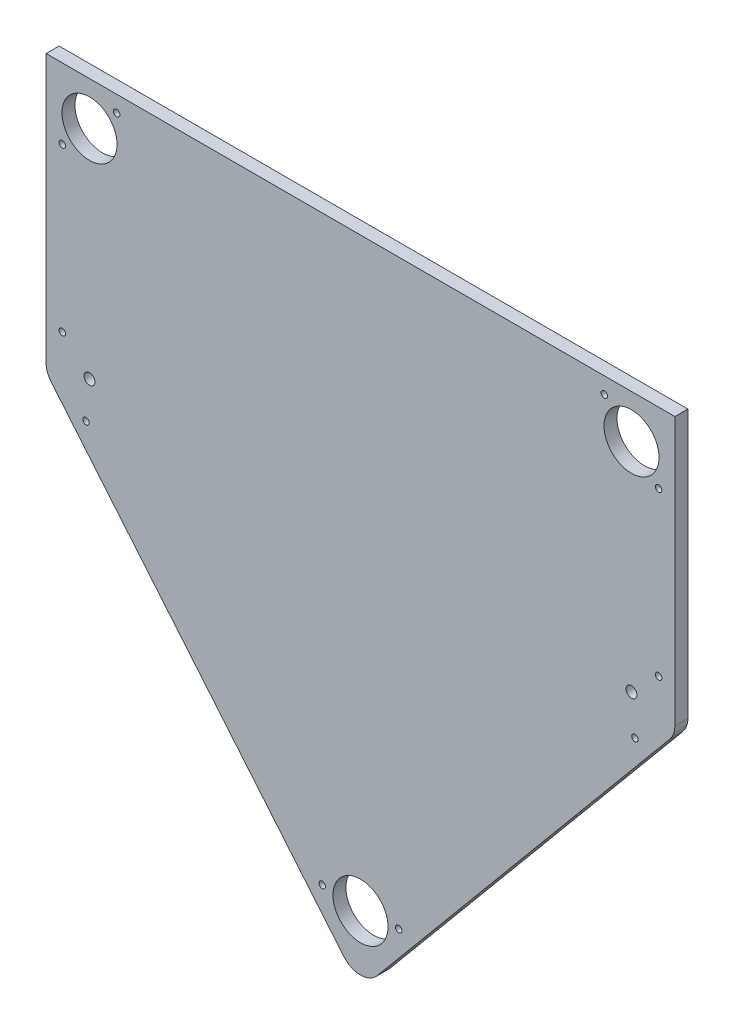
ISO-10303-21;
HEADER;
FILE_DESCRIPTION(('STEP AP214'),'2;1');
FILE_NAME('part.step','',(''),(''),'','','');
FILE_SCHEMA(('AUTOMOTIVE_DESIGN { 1 0 10303 214 1 1 1 1 }'));
ENDSEC;
DATA;
#1=APPLICATION_CONTEXT('core data for automotive mechanical design processes');
#2=APPLICATION_PROTOCOL_DEFINITION('international standard','automotive_design',2000,#1);
#3=PRODUCT_CONTEXT('',#1,'mechanical');
#4=PRODUCT('Part','Part','',(#3));
#5=PRODUCT_RELATED_PRODUCT_CATEGORY('part','',(#4));
#6=PRODUCT_DEFINITION_FORMATION('','',#4);
#7=PRODUCT_DEFINITION_CONTEXT('part definition',#1,'design');
#8=PRODUCT_DEFINITION('design','',#6,#7);
#9=PRODUCT_DEFINITION_SHAPE('','',#8);
#10=(LENGTH_UNIT() NAMED_UNIT(*) SI_UNIT(.MILLI.,.METRE.));
#11=(NAMED_UNIT(*) PLANE_ANGLE_UNIT() SI_UNIT($,.RADIAN.));
#12=(NAMED_UNIT(*) SI_UNIT($,.STERADIAN.) SOLID_ANGLE_UNIT());
#13=UNCERTAINTY_MEASURE_WITH_UNIT(LENGTH_MEASURE(1.E-05),#10,'distance_accuracy_value','');
#14=(GEOMETRIC_REPRESENTATION_CONTEXT(3) GLOBAL_UNCERTAINTY_ASSIGNED_CONTEXT((#13)) GLOBAL_UNIT_ASSIGNED_CONTEXT((#10,
#11,#12)) REPRESENTATION_CONTEXT('',''));
#15=CARTESIAN_POINT('',(0.,0.,0.));
#16=DIRECTION('',(0.,0.,1.));
#17=DIRECTION('',(1.,0.,0.));
#18=AXIS2_PLACEMENT_3D('',#15,#16,#17);
#19=CARTESIAN_POINT('',(0.,0.,6.));
#20=DIRECTION('',(0.,0.,-1.));
#21=DIRECTION('',(-1.,0.,0.));
#22=AXIS2_PLACEMENT_3D('',#19,#20,#21);
#23=PLANE('',#22);
#24=DIRECTION('',(0.,-1.,0.));
#25=VECTOR('',#24,1.);
#26=CARTESIAN_POINT('',(-145.,-7.24099870362663,6.));
#27=LINE('',#26,#25);
#28=CARTESIAN_POINT('',(-145.,120.,6.));
#29=VERTEX_POINT('',#28);
#30=CARTESIAN_POINT('',(-145.,-3.62049935181336,6.));
#31=VERTEX_POINT('',#30);
#32=EDGE_CURVE('E141',#29,#31,#27,.T.);
#33=ORIENTED_EDGE('',*,*,#32,.T.);
#34=CARTESIAN_POINT('',(-135.,-3.62049935181336,6.));
#35=DIRECTION('',(0.,0.,-1.));
#36=DIRECTION('',(-1.,0.,0.));
#37=AXIS2_PLACEMENT_3D('',#34,#35,#36);
#38=CIRCLE('',#37,10.);
#39=CARTESIAN_POINT('',(-142.682212795974,-10.0223433484581,6.));
#40=VERTEX_POINT('',#39);
#41=EDGE_CURVE('E158',#31,#40,#38,.F.);
#42=ORIENTED_EDGE('',*,*,#41,.T.);
#43=DIRECTION('',(0.64018439966448,-0.768221279597376,0.));
#44=VECTOR('',#43,1.);
#45=CARTESIAN_POINT('',(0.,-181.240998703627,6.));
#46=LINE('',#45,#44);
#47=CARTESIAN_POINT('',(-7.68221279597373,-172.022343348458,6.));
#48=VERTEX_POINT('',#47);
#49=EDGE_CURVE('E215',#40,#48,#46,.T.);
#50=ORIENTED_EDGE('',*,*,#49,.T.);
#51=CARTESIAN_POINT('',(0.,-165.620499351813,6.));
#52=DIRECTION('',(0.,0.,-1.));
#53=DIRECTION('',(-1.,0.,0.));
#54=AXIS2_PLACEMENT_3D('',#51,#52,#53);
#55=CIRCLE('',#54,10.);
#56=CARTESIAN_POINT('',(7.68221279597378,-172.022343348458,6.));
#57=VERTEX_POINT('',#56);
#58=EDGE_CURVE('E155',#48,#57,#55,.F.);
#59=ORIENTED_EDGE('',*,*,#58,.T.);
#60=DIRECTION('',(0.64018439966448,0.768221279597375,0.));
#61=VECTOR('',#60,1.);
#62=CARTESIAN_POINT('',(145.,-7.24099870362678,6.));
#63=LINE('',#62,#61);
#64=CARTESIAN_POINT('',(142.682212795974,-10.0223433484583,6.));
#65=VERTEX_POINT('',#64);
#66=EDGE_CURVE('E111',#57,#65,#63,.T.);
#67=ORIENTED_EDGE('',*,*,#66,.T.);
#68=CARTESIAN_POINT('',(135.,-3.62049935181347,6.));
#69=DIRECTION('',(0.,0.,-1.));
#70=DIRECTION('',(-1.,0.,0.));
#71=AXIS2_PLACEMENT_3D('',#68,#69,#70);
#72=CIRCLE('',#71,10.);
#73=CARTESIAN_POINT('',(145.,-3.62049935181347,6.));
#74=VERTEX_POINT('',#73);
#75=EDGE_CURVE('E54',#65,#74,#72,.F.);
#76=ORIENTED_EDGE('',*,*,#75,.T.);
#77=DIRECTION('',(0.,1.,0.));
#78=VECTOR('',#77,1.);
#79=CARTESIAN_POINT('',(145.,120.,6.));
#80=LINE('',#79,#78);
#81=CARTESIAN_POINT('',(145.,120.,6.));
#82=VERTEX_POINT('',#81);
#83=EDGE_CURVE('E101',#74,#82,#80,.T.);
#84=ORIENTED_EDGE('',*,*,#83,.T.);
#85=DIRECTION('',(-1.,0.,0.));
#86=VECTOR('',#85,1.);
#87=CARTESIAN_POINT('',(-145.,120.,6.));
#88=LINE('',#87,#86);
#89=EDGE_CURVE('E106',#82,#29,#88,.T.);
#90=ORIENTED_EDGE('',*,*,#89,.T.);
#91=EDGE_LOOP('',(#33,#42,#50,#59,#67,#76,#84,#90));
#92=FACE_BOUND('',#91,.T.);
#93=CARTESIAN_POINT('',(-125.,100.,6.));
#94=DIRECTION('',(0.,0.,1.));
#95=DIRECTION('',(1.,0.,0.));
#96=AXIS2_PLACEMENT_3D('',#93,#94,#95);
#97=CIRCLE('',#96,12.7);
#98=CARTESIAN_POINT('',(-112.3,100.,6.));
#99=VERTEX_POINT('',#98);
#100=EDGE_CURVE('E134',#99,#99,#97,.T.);
#101=ORIENTED_EDGE('',*,*,#100,.F.);
#102=EDGE_LOOP('',(#101));
#103=FACE_BOUND('',#102,.T.);
#104=CARTESIAN_POINT('',(125.,100.,6.));
#105=DIRECTION('',(0.,0.,1.));
#106=DIRECTION('',(1.,0.,0.));
#107=AXIS2_PLACEMENT_3D('',#104,#105,#106);
#108=CIRCLE('',#107,12.7);
#109=CARTESIAN_POINT('',(137.7,100.,6.));
#110=VERTEX_POINT('',#109);
#111=EDGE_CURVE('E223',#110,#110,#108,.T.);
#112=ORIENTED_EDGE('',*,*,#111,.F.);
#113=EDGE_LOOP('',(#112));
#114=FACE_BOUND('',#113,.T.);
#115=CARTESIAN_POINT('',(-125.,0.,6.));
#116=DIRECTION('',(0.,0.,1.));
#117=DIRECTION('',(1.,0.,0.));
#118=AXIS2_PLACEMENT_3D('',#115,#116,#117);
#119=CIRCLE('',#118,2.50000000000001);
#120=CARTESIAN_POINT('',(-122.5,0.,6.));
#121=VERTEX_POINT('',#120);
#122=EDGE_CURVE('E229',#121,#121,#119,.T.);
#123=ORIENTED_EDGE('',*,*,#122,.F.);
#124=EDGE_LOOP('',(#123));
#125=FACE_BOUND('',#124,.T.);
#126=CARTESIAN_POINT('',(125.,0.,6.));
#127=DIRECTION('',(0.,0.,1.));
#128=DIRECTION('',(1.,0.,0.));
#129=AXIS2_PLACEMENT_3D('',#126,#127,#128);
#130=CIRCLE('',#129,2.5);
#131=CARTESIAN_POINT('',(127.5,0.,6.));
#132=VERTEX_POINT('',#131);
#133=EDGE_CURVE('E235',#132,#132,#130,.T.);
#134=ORIENTED_EDGE('',*,*,#133,.F.);
#135=EDGE_LOOP('',(#134));
#136=FACE_BOUND('',#135,.T.);
#137=CARTESIAN_POINT('',(0.,-150.,6.));
#138=DIRECTION('',(0.,0.,1.));
#139=DIRECTION('',(1.,0.,0.));
#140=AXIS2_PLACEMENT_3D('',#137,#138,#139);
#141=CIRCLE('',#140,12.7);
#142=CARTESIAN_POINT('',(12.7,-150.,6.));
#143=VERTEX_POINT('',#142);
#144=EDGE_CURVE('E241',#143,#143,#141,.T.);
#145=ORIENTED_EDGE('',*,*,#144,.F.);
#146=EDGE_LOOP('',(#145));
#147=FACE_BOUND('',#146,.T.);
#148=CARTESIAN_POINT('',(-112.484209972998,112.515790027002,6.));
#149=DIRECTION('',(0.,0.,1.));
#150=DIRECTION('',(1.,0.,0.));
#151=AXIS2_PLACEMENT_3D('',#148,#149,#150);
#152=CIRCLE('',#151,1.5);
#153=CARTESIAN_POINT('',(-110.984209972998,112.515790027002,6.));
#154=VERTEX_POINT('',#153);
#155=EDGE_CURVE('E247',#154,#154,#152,.T.);
#156=ORIENTED_EDGE('',*,*,#155,.F.);
#157=EDGE_LOOP('',(#156));
#158=FACE_BOUND('',#157,.T.);
#159=CARTESIAN_POINT('',(-137.515790027002,87.4842099729981,6.));
#160=DIRECTION('',(0.,0.,1.));
#161=DIRECTION('',(1.,0.,0.));
#162=AXIS2_PLACEMENT_3D('',#159,#160,#161);
#163=CIRCLE('',#162,1.5);
#164=CARTESIAN_POINT('',(-136.015790027002,87.4842099729981,6.));
#165=VERTEX_POINT('',#164);
#166=EDGE_CURVE('E253',#165,#165,#163,.T.);
#167=ORIENTED_EDGE('',*,*,#166,.F.);
#168=EDGE_LOOP('',(#167));
#169=FACE_BOUND('',#168,.T.);
#170=CARTESIAN_POINT('',(-137.515790027002,12.5157900270019,6.));
#171=DIRECTION('',(0.,0.,1.));
#172=DIRECTION('',(1.,0.,0.));
#173=AXIS2_PLACEMENT_3D('',#170,#171,#172);
#174=CIRCLE('',#173,1.5);
#175=CARTESIAN_POINT('',(-136.015790027002,12.5157900270019,6.));
#176=VERTEX_POINT('',#175);
#177=EDGE_CURVE('E259',#176,#176,#174,.T.);
#178=ORIENTED_EDGE('',*,*,#177,.F.);
#179=EDGE_LOOP('',(#178));
#180=FACE_BOUND('',#179,.T.);
#181=CARTESIAN_POINT('',(-126.602482704953,-17.6273097544784,6.));
#182=DIRECTION('',(0.,0.,1.));
#183=DIRECTION('',(1.,0.,0.));
#184=AXIS2_PLACEMENT_3D('',#181,#182,#183);
#185=CIRCLE('',#184,1.5);
#186=CARTESIAN_POINT('',(-125.102482704953,-17.6273097544784,6.));
#187=VERTEX_POINT('',#186);
#188=EDGE_CURVE('E265',#187,#187,#185,.T.);
#189=ORIENTED_EDGE('',*,*,#188,.F.);
#190=EDGE_LOOP('',(#189));
#191=FACE_BOUND('',#190,.T.);
#192=CARTESIAN_POINT('',(-17.6273097544784,-148.397517295047,6.));
#193=DIRECTION('',(0.,0.,1.));
#194=DIRECTION('',(1.,0.,0.));
#195=AXIS2_PLACEMENT_3D('',#192,#193,#194);
#196=CIRCLE('',#195,1.5);
#197=CARTESIAN_POINT('',(-16.1273097544784,-148.397517295047,6.));
#198=VERTEX_POINT('',#197);
#199=EDGE_CURVE('E271',#198,#198,#196,.T.);
#200=ORIENTED_EDGE('',*,*,#199,.F.);
#201=EDGE_LOOP('',(#200));
#202=FACE_BOUND('',#201,.T.);
#203=CARTESIAN_POINT('',(17.6273097544784,-148.397517295047,6.));
#204=DIRECTION('',(0.,0.,1.));
#205=DIRECTION('',(-1.,0.,0.));
#206=AXIS2_PLACEMENT_3D('',#203,#204,#205);
#207=CIRCLE('',#206,1.5);
#208=CARTESIAN_POINT('',(16.1273097544784,-148.397517295047,6.));
#209=VERTEX_POINT('',#208);
#210=EDGE_CURVE('E277',#209,#209,#207,.T.);
#211=ORIENTED_EDGE('',*,*,#210,.F.);
#212=EDGE_LOOP('',(#211));
#213=FACE_BOUND('',#212,.T.);
#214=CARTESIAN_POINT('',(126.602482704953,-17.6273097544784,6.));
#215=DIRECTION('',(0.,0.,1.));
#216=DIRECTION('',(-1.,0.,0.));
#217=AXIS2_PLACEMENT_3D('',#214,#215,#216);
#218=CIRCLE('',#217,1.5);
#219=CARTESIAN_POINT('',(125.102482704953,-17.6273097544784,6.));
#220=VERTEX_POINT('',#219);
#221=EDGE_CURVE('E283',#220,#220,#218,.T.);
#222=ORIENTED_EDGE('',*,*,#221,.F.);
#223=EDGE_LOOP('',(#222));
#224=FACE_BOUND('',#223,.T.);
#225=CARTESIAN_POINT('',(137.515790027002,12.5157900270019,6.));
#226=DIRECTION('',(0.,0.,1.));
#227=DIRECTION('',(-1.,0.,0.));
#228=AXIS2_PLACEMENT_3D('',#225,#226,#227);
#229=CIRCLE('',#228,1.5);
#230=CARTESIAN_POINT('',(136.015790027002,12.5157900270019,6.));
#231=VERTEX_POINT('',#230);
#232=EDGE_CURVE('E289',#231,#231,#229,.T.);
#233=ORIENTED_EDGE('',*,*,#232,.F.);
#234=EDGE_LOOP('',(#233));
#235=FACE_BOUND('',#234,.T.);
#236=CARTESIAN_POINT('',(137.515790027002,87.4842099729981,6.));
#237=DIRECTION('',(0.,0.,1.));
#238=DIRECTION('',(-1.,0.,0.));
#239=AXIS2_PLACEMENT_3D('',#236,#237,#238);
#240=CIRCLE('',#239,1.5);
#241=CARTESIAN_POINT('',(136.015790027002,87.4842099729981,6.));
#242=VERTEX_POINT('',#241);
#243=EDGE_CURVE('E295',#242,#242,#240,.T.);
#244=ORIENTED_EDGE('',*,*,#243,.F.);
#245=EDGE_LOOP('',(#244));
#246=FACE_BOUND('',#245,.T.);
#247=CARTESIAN_POINT('',(112.484209972998,112.515790027002,6.));
#248=DIRECTION('',(0.,0.,1.));
#249=DIRECTION('',(-1.,0.,0.));
#250=AXIS2_PLACEMENT_3D('',#247,#248,#249);
#251=CIRCLE('',#250,1.5);
#252=CARTESIAN_POINT('',(110.984209972998,112.515790027002,6.));
#253=VERTEX_POINT('',#252);
#254=EDGE_CURVE('E301',#253,#253,#251,.T.);
#255=ORIENTED_EDGE('',*,*,#254,.F.);
#256=EDGE_LOOP('',(#255));
#257=FACE_BOUND('',#256,.T.);
#258=ADVANCED_FACE('F39',(#92,#103,#114,#125,#136,#147,#158,#169,#180,#191,#202,#213,#224,#235,
#246,#257),#23,.F.);
#259=CARTESIAN_POINT('',(0.,0.,0.));
#260=DIRECTION('',(0.,0.,-1.));
#261=DIRECTION('',(-1.,0.,0.));
#262=AXIS2_PLACEMENT_3D('',#259,#260,#261);
#263=PLANE('',#262);
#264=CARTESIAN_POINT('',(137.515790027002,87.4842099729981,0.));
#265=DIRECTION('',(0.,0.,1.));
#266=DIRECTION('',(-1.,0.,0.));
#267=AXIS2_PLACEMENT_3D('',#264,#265,#266);
#268=CIRCLE('',#267,1.5);
#269=CARTESIAN_POINT('',(136.015790027002,87.4842099729981,0.));
#270=VERTEX_POINT('',#269);
#271=EDGE_CURVE('E298',#270,#270,#268,.T.);
#272=ORIENTED_EDGE('',*,*,#271,.T.);
#273=EDGE_LOOP('',(#272));
#274=FACE_BOUND('',#273,.T.);
#275=CARTESIAN_POINT('',(126.602482704953,-17.6273097544784,0.));
#276=DIRECTION('',(0.,0.,1.));
#277=DIRECTION('',(-1.,0.,0.));
#278=AXIS2_PLACEMENT_3D('',#275,#276,#277);
#279=CIRCLE('',#278,1.5);
#280=CARTESIAN_POINT('',(125.102482704953,-17.6273097544784,0.));
#281=VERTEX_POINT('',#280);
#282=EDGE_CURVE('E286',#281,#281,#279,.T.);
#283=ORIENTED_EDGE('',*,*,#282,.T.);
#284=EDGE_LOOP('',(#283));
#285=FACE_BOUND('',#284,.T.);
#286=CARTESIAN_POINT('',(-17.6273097544784,-148.397517295047,0.));
#287=DIRECTION('',(0.,0.,1.));
#288=DIRECTION('',(1.,0.,0.));
#289=AXIS2_PLACEMENT_3D('',#286,#287,#288);
#290=CIRCLE('',#289,1.5);
#291=CARTESIAN_POINT('',(-16.1273097544784,-148.397517295047,0.));
#292=VERTEX_POINT('',#291);
#293=EDGE_CURVE('E274',#292,#292,#290,.T.);
#294=ORIENTED_EDGE('',*,*,#293,.T.);
#295=EDGE_LOOP('',(#294));
#296=FACE_BOUND('',#295,.T.);
#297=CARTESIAN_POINT('',(-137.515790027002,12.5157900270019,0.));
#298=DIRECTION('',(0.,0.,1.));
#299=DIRECTION('',(1.,0.,0.));
#300=AXIS2_PLACEMENT_3D('',#297,#298,#299);
#301=CIRCLE('',#300,1.5);
#302=CARTESIAN_POINT('',(-136.015790027002,12.5157900270019,0.));
#303=VERTEX_POINT('',#302);
#304=EDGE_CURVE('E262',#303,#303,#301,.T.);
#305=ORIENTED_EDGE('',*,*,#304,.T.);
#306=EDGE_LOOP('',(#305));
#307=FACE_BOUND('',#306,.T.);
#308=CARTESIAN_POINT('',(-112.484209972998,112.515790027002,0.));
#309=DIRECTION('',(0.,0.,1.));
#310=DIRECTION('',(1.,0.,0.));
#311=AXIS2_PLACEMENT_3D('',#308,#309,#310);
#312=CIRCLE('',#311,1.5);
#313=CARTESIAN_POINT('',(-110.984209972998,112.515790027002,0.));
#314=VERTEX_POINT('',#313);
#315=EDGE_CURVE('E250',#314,#314,#312,.T.);
#316=ORIENTED_EDGE('',*,*,#315,.T.);
#317=EDGE_LOOP('',(#316));
#318=FACE_BOUND('',#317,.T.);
#319=CARTESIAN_POINT('',(125.,0.,0.));
#320=DIRECTION('',(0.,0.,1.));
#321=DIRECTION('',(1.,0.,0.));
#322=AXIS2_PLACEMENT_3D('',#319,#320,#321);
#323=CIRCLE('',#322,2.5);
#324=CARTESIAN_POINT('',(127.5,0.,0.));
#325=VERTEX_POINT('',#324);
#326=EDGE_CURVE('E238',#325,#325,#323,.T.);
#327=ORIENTED_EDGE('',*,*,#326,.T.);
#328=EDGE_LOOP('',(#327));
#329=FACE_BOUND('',#328,.T.);
#330=CARTESIAN_POINT('',(125.,100.,0.));
#331=DIRECTION('',(0.,0.,1.));
#332=DIRECTION('',(1.,0.,0.));
#333=AXIS2_PLACEMENT_3D('',#330,#331,#332);
#334=CIRCLE('',#333,12.7);
#335=CARTESIAN_POINT('',(137.7,100.,0.));
#336=VERTEX_POINT('',#335);
#337=EDGE_CURVE('E226',#336,#336,#334,.T.);
#338=ORIENTED_EDGE('',*,*,#337,.T.);
#339=EDGE_LOOP('',(#338));
#340=FACE_BOUND('',#339,.T.);
#341=DIRECTION('',(0.64018439966448,-0.768221279597376,0.));
#342=VECTOR('',#341,1.);
#343=CARTESIAN_POINT('',(0.,-181.240998703627,0.));
#344=LINE('',#343,#342);
#345=CARTESIAN_POINT('',(-142.682212795974,-10.0223433484581,0.));
#346=VERTEX_POINT('',#345);
#347=CARTESIAN_POINT('',(-7.68221279597373,-172.022343348458,0.));
#348=VERTEX_POINT('',#347);
#349=EDGE_CURVE('E133',#346,#348,#344,.T.);
#350=ORIENTED_EDGE('',*,*,#349,.F.);
#351=CARTESIAN_POINT('',(-135.,-3.62049935181336,0.));
#352=DIRECTION('',(0.,0.,-1.));
#353=DIRECTION('',(-1.,0.,0.));
#354=AXIS2_PLACEMENT_3D('',#351,#352,#353);
#355=CIRCLE('',#354,10.);
#356=CARTESIAN_POINT('',(-145.,-3.62049935181336,0.));
#357=VERTEX_POINT('',#356);
#358=EDGE_CURVE('E151',#346,#357,#355,.T.);
#359=ORIENTED_EDGE('',*,*,#358,.T.);
#360=DIRECTION('',(0.,-1.,0.));
#361=VECTOR('',#360,1.);
#362=CARTESIAN_POINT('',(-145.,-7.24099870362663,0.));
#363=LINE('',#362,#361);
#364=CARTESIAN_POINT('',(-145.,120.,0.));
#365=VERTEX_POINT('',#364);
#366=EDGE_CURVE('E130',#365,#357,#363,.T.);
#367=ORIENTED_EDGE('',*,*,#366,.F.);
#368=DIRECTION('',(-1.,0.,0.));
#369=VECTOR('',#368,1.);
#370=CARTESIAN_POINT('',(-145.,120.,0.));
#371=LINE('',#370,#369);
#372=CARTESIAN_POINT('',(145.,120.,0.));
#373=VERTEX_POINT('',#372);
#374=EDGE_CURVE('E140',#373,#365,#371,.T.);
#375=ORIENTED_EDGE('',*,*,#374,.F.);
#376=DIRECTION('',(0.,1.,0.));
#377=VECTOR('',#376,1.);
#378=CARTESIAN_POINT('',(145.,120.,0.));
#379=LINE('',#378,#377);
#380=CARTESIAN_POINT('',(145.,-3.62049935181347,0.));
#381=VERTEX_POINT('',#380);
#382=EDGE_CURVE('E117',#381,#373,#379,.T.);
#383=ORIENTED_EDGE('',*,*,#382,.F.);
#384=CARTESIAN_POINT('',(135.,-3.62049935181347,0.));
#385=DIRECTION('',(0.,0.,-1.));
#386=DIRECTION('',(-1.,0.,0.));
#387=AXIS2_PLACEMENT_3D('',#384,#385,#386);
#388=CIRCLE('',#387,10.);
#389=CARTESIAN_POINT('',(142.682212795974,-10.0223433484583,0.));
#390=VERTEX_POINT('',#389);
#391=EDGE_CURVE('E149',#381,#390,#388,.T.);
#392=ORIENTED_EDGE('',*,*,#391,.T.);
#393=DIRECTION('',(0.64018439966448,0.768221279597375,0.));
#394=VECTOR('',#393,1.);
#395=CARTESIAN_POINT('',(145.,-7.24099870362678,0.));
#396=LINE('',#395,#394);
#397=CARTESIAN_POINT('',(7.68221279597378,-172.022343348458,0.));
#398=VERTEX_POINT('',#397);
#399=EDGE_CURVE('E137',#398,#390,#396,.T.);
#400=ORIENTED_EDGE('',*,*,#399,.F.);
#401=CARTESIAN_POINT('',(0.,-165.620499351813,0.));
#402=DIRECTION('',(0.,0.,-1.));
#403=DIRECTION('',(-1.,0.,0.));
#404=AXIS2_PLACEMENT_3D('',#401,#402,#403);
#405=CIRCLE('',#404,10.);
#406=EDGE_CURVE('E147',#398,#348,#405,.T.);
#407=ORIENTED_EDGE('',*,*,#406,.T.);
#408=EDGE_LOOP('',(#350,#359,#367,#375,#383,#392,#400,#407));
#409=FACE_BOUND('',#408,.T.);
#410=CARTESIAN_POINT('',(-125.,100.,0.));
#411=DIRECTION('',(0.,0.,1.));
#412=DIRECTION('',(1.,0.,0.));
#413=AXIS2_PLACEMENT_3D('',#410,#411,#412);
#414=CIRCLE('',#413,12.7);
#415=CARTESIAN_POINT('',(-112.3,100.,0.));
#416=VERTEX_POINT('',#415);
#417=EDGE_CURVE('E220',#416,#416,#414,.T.);
#418=ORIENTED_EDGE('',*,*,#417,.T.);
#419=EDGE_LOOP('',(#418));
#420=FACE_BOUND('',#419,.T.);
#421=CARTESIAN_POINT('',(-125.,0.,0.));
#422=DIRECTION('',(0.,0.,1.));
#423=DIRECTION('',(1.,0.,0.));
#424=AXIS2_PLACEMENT_3D('',#421,#422,#423);
#425=CIRCLE('',#424,2.50000000000001);
#426=CARTESIAN_POINT('',(-122.5,0.,0.));
#427=VERTEX_POINT('',#426);
#428=EDGE_CURVE('E232',#427,#427,#425,.T.);
#429=ORIENTED_EDGE('',*,*,#428,.T.);
#430=EDGE_LOOP('',(#429));
#431=FACE_BOUND('',#430,.T.);
#432=CARTESIAN_POINT('',(0.,-150.,0.));
#433=DIRECTION('',(0.,0.,1.));
#434=DIRECTION('',(1.,0.,0.));
#435=AXIS2_PLACEMENT_3D('',#432,#433,#434);
#436=CIRCLE('',#435,12.7);
#437=CARTESIAN_POINT('',(12.7,-150.,0.));
#438=VERTEX_POINT('',#437);
#439=EDGE_CURVE('E244',#438,#438,#436,.T.);
#440=ORIENTED_EDGE('',*,*,#439,.T.);
#441=EDGE_LOOP('',(#440));
#442=FACE_BOUND('',#441,.T.);
#443=CARTESIAN_POINT('',(-137.515790027002,87.4842099729981,0.));
#444=DIRECTION('',(0.,0.,1.));
#445=DIRECTION('',(1.,0.,0.));
#446=AXIS2_PLACEMENT_3D('',#443,#444,#445);
#447=CIRCLE('',#446,1.5);
#448=CARTESIAN_POINT('',(-136.015790027002,87.4842099729981,0.));
#449=VERTEX_POINT('',#448);
#450=EDGE_CURVE('E256',#449,#449,#447,.T.);
#451=ORIENTED_EDGE('',*,*,#450,.T.);
#452=EDGE_LOOP('',(#451));
#453=FACE_BOUND('',#452,.T.);
#454=CARTESIAN_POINT('',(-126.602482704953,-17.6273097544784,0.));
#455=DIRECTION('',(0.,0.,1.));
#456=DIRECTION('',(1.,0.,0.));
#457=AXIS2_PLACEMENT_3D('',#454,#455,#456);
#458=CIRCLE('',#457,1.5);
#459=CARTESIAN_POINT('',(-125.102482704953,-17.6273097544784,0.));
#460=VERTEX_POINT('',#459);
#461=EDGE_CURVE('E268',#460,#460,#458,.T.);
#462=ORIENTED_EDGE('',*,*,#461,.T.);
#463=EDGE_LOOP('',(#462));
#464=FACE_BOUND('',#463,.T.);
#465=CARTESIAN_POINT('',(17.6273097544784,-148.397517295047,0.));
#466=DIRECTION('',(0.,0.,1.));
#467=DIRECTION('',(-1.,0.,0.));
#468=AXIS2_PLACEMENT_3D('',#465,#466,#467);
#469=CIRCLE('',#468,1.5);
#470=CARTESIAN_POINT('',(16.1273097544784,-148.397517295047,0.));
#471=VERTEX_POINT('',#470);
#472=EDGE_CURVE('E280',#471,#471,#469,.T.);
#473=ORIENTED_EDGE('',*,*,#472,.T.);
#474=EDGE_LOOP('',(#473));
#475=FACE_BOUND('',#474,.T.);
#476=CARTESIAN_POINT('',(137.515790027002,12.5157900270019,0.));
#477=DIRECTION('',(0.,0.,1.));
#478=DIRECTION('',(-1.,0.,0.));
#479=AXIS2_PLACEMENT_3D('',#476,#477,#478);
#480=CIRCLE('',#479,1.5);
#481=CARTESIAN_POINT('',(136.015790027002,12.5157900270019,0.));
#482=VERTEX_POINT('',#481);
#483=EDGE_CURVE('E292',#482,#482,#480,.T.);
#484=ORIENTED_EDGE('',*,*,#483,.T.);
#485=EDGE_LOOP('',(#484));
#486=FACE_BOUND('',#485,.T.);
#487=CARTESIAN_POINT('',(112.484209972998,112.515790027002,0.));
#488=DIRECTION('',(0.,0.,1.));
#489=DIRECTION('',(-1.,0.,0.));
#490=AXIS2_PLACEMENT_3D('',#487,#488,#489);
#491=CIRCLE('',#490,1.5);
#492=CARTESIAN_POINT('',(110.984209972998,112.515790027002,0.));
#493=VERTEX_POINT('',#492);
#494=EDGE_CURVE('E304',#493,#493,#491,.T.);
#495=ORIENTED_EDGE('',*,*,#494,.T.);
#496=EDGE_LOOP('',(#495));
#497=FACE_BOUND('',#496,.T.);
#498=ADVANCED_FACE('F169',(#274,#285,#296,#307,#318,#329,#340,#409,#420,#431,#442,#453,#464,
#475,#486,#497),#263,.T.);
#499=CARTESIAN_POINT('',(-145.,-7.24099870362663,6.));
#500=DIRECTION('',(1.,0.,0.));
#501=DIRECTION('',(0.,0.,-1.));
#502=AXIS2_PLACEMENT_3D('',#499,#500,#501);
#503=PLANE('',#502);
#504=ORIENTED_EDGE('',*,*,#366,.T.);
#505=DIRECTION('',(0.,0.,-1.));
#506=VECTOR('',#505,1.);
#507=CARTESIAN_POINT('',(-145.,-3.62049935181336,6.));
#508=LINE('',#507,#506);
#509=EDGE_CURVE('E153',#357,#31,#508,.F.);
#510=ORIENTED_EDGE('',*,*,#509,.T.);
#511=ORIENTED_EDGE('',*,*,#32,.F.);
#512=DIRECTION('',(0.,0.,-1.));
#513=VECTOR('',#512,1.);
#514=CARTESIAN_POINT('',(-145.,120.,6.));
#515=LINE('',#514,#513);
#516=EDGE_CURVE('E121',#29,#365,#515,.T.);
#517=ORIENTED_EDGE('',*,*,#516,.T.);
#518=EDGE_LOOP('',(#504,#510,#511,#517));
#519=FACE_BOUND('',#518,.T.);
#520=ADVANCED_FACE('F188',(#519),#503,.F.);
#521=CARTESIAN_POINT('',(0.,-181.240998703627,6.));
#522=DIRECTION('',(0.768221279597376,0.64018439966448,0.));
#523=DIRECTION('',(-0.64018439966448,0.768221279597376,0.));
#524=AXIS2_PLACEMENT_3D('',#521,#522,#523);
#525=PLANE('',#524);
#526=ORIENTED_EDGE('',*,*,#49,.F.);
#527=DIRECTION('',(0.,0.,-1.));
#528=VECTOR('',#527,1.);
#529=CARTESIAN_POINT('',(-142.682212795974,-10.0223433484582,6.));
#530=LINE('',#529,#528);
#531=EDGE_CURVE('E144',#40,#346,#530,.T.);
#532=ORIENTED_EDGE('',*,*,#531,.T.);
#533=ORIENTED_EDGE('',*,*,#349,.T.);
#534=DIRECTION('',(0.,0.,-1.));
#535=VECTOR('',#534,1.);
#536=CARTESIAN_POINT('',(-7.68221279597373,-172.022343348458,6.));
#537=LINE('',#536,#535);
#538=EDGE_CURVE('E120',#348,#48,#537,.F.);
#539=ORIENTED_EDGE('',*,*,#538,.T.);
#540=EDGE_LOOP('',(#526,#532,#533,#539));
#541=FACE_BOUND('',#540,.T.);
#542=ADVANCED_FACE('F201',(#541),#525,.F.);
#543=CARTESIAN_POINT('',(145.,-7.24099870362678,6.));
#544=DIRECTION('',(-0.768221279597376,0.64018439966448,0.));
#545=DIRECTION('',(-0.64018439966448,-0.768221279597376,0.));
#546=AXIS2_PLACEMENT_3D('',#543,#544,#545);
#547=PLANE('',#546);
#548=ORIENTED_EDGE('',*,*,#399,.T.);
#549=DIRECTION('',(0.,0.,-1.));
#550=VECTOR('',#549,1.);
#551=CARTESIAN_POINT('',(142.682212795974,-10.0223433484583,6.));
#552=LINE('',#551,#550);
#553=EDGE_CURVE('E11',#390,#65,#552,.F.);
#554=ORIENTED_EDGE('',*,*,#553,.T.);
#555=ORIENTED_EDGE('',*,*,#66,.F.);
#556=DIRECTION('',(0.,0.,-1.));
#557=VECTOR('',#556,1.);
#558=CARTESIAN_POINT('',(7.68221279597378,-172.022343348458,6.));
#559=LINE('',#558,#557);
#560=EDGE_CURVE('E47',#57,#398,#559,.T.);
#561=ORIENTED_EDGE('',*,*,#560,.T.);
#562=EDGE_LOOP('',(#548,#554,#555,#561));
#563=FACE_BOUND('',#562,.T.);
#564=ADVANCED_FACE('F164',(#563),#547,.F.);
#565=CARTESIAN_POINT('',(145.,120.,6.));
#566=DIRECTION('',(-1.,0.,0.));
#567=DIRECTION('',(0.,-1.,0.));
#568=AXIS2_PLACEMENT_3D('',#565,#566,#567);
#569=PLANE('',#568);
#570=ORIENTED_EDGE('',*,*,#83,.F.);
#571=DIRECTION('',(0.,0.,-1.));
#572=VECTOR('',#571,1.);
#573=CARTESIAN_POINT('',(145.,-3.62049935181347,6.));
#574=LINE('',#573,#572);
#575=EDGE_CURVE('E160',#74,#381,#574,.T.);
#576=ORIENTED_EDGE('',*,*,#575,.T.);
#577=ORIENTED_EDGE('',*,*,#382,.T.);
#578=DIRECTION('',(0.,0.,-1.));
#579=VECTOR('',#578,1.);
#580=CARTESIAN_POINT('',(145.,120.,6.));
#581=LINE('',#580,#579);
#582=EDGE_CURVE('E114',#82,#373,#581,.T.);
#583=ORIENTED_EDGE('',*,*,#582,.F.);
#584=EDGE_LOOP('',(#570,#576,#577,#583));
#585=FACE_BOUND('',#584,.T.);
#586=ADVANCED_FACE('F115',(#585),#569,.F.);
#587=CARTESIAN_POINT('',(-145.,120.,6.));
#588=DIRECTION('',(0.,-1.,0.));
#589=DIRECTION('',(0.,0.,-1.));
#590=AXIS2_PLACEMENT_3D('',#587,#588,#589);
#591=PLANE('',#590);
#592=ORIENTED_EDGE('',*,*,#374,.T.);
#593=ORIENTED_EDGE('',*,*,#516,.F.);
#594=ORIENTED_EDGE('',*,*,#89,.F.);
#595=ORIENTED_EDGE('',*,*,#582,.T.);
#596=EDGE_LOOP('',(#592,#593,#594,#595));
#597=FACE_BOUND('',#596,.T.);
#598=ADVANCED_FACE('F123',(#597),#591,.F.);
#599=CARTESIAN_POINT('',(-125.,100.,6.));
#600=DIRECTION('',(0.,0.,-1.));
#601=DIRECTION('',(-1.,0.,0.));
#602=AXIS2_PLACEMENT_3D('',#599,#600,#601);
#603=CYLINDRICAL_SURFACE('',#602,12.7);
#604=ORIENTED_EDGE('',*,*,#100,.T.);
#605=EDGE_LOOP('',(#604));
#606=FACE_BOUND('',#605,.T.);
#607=ORIENTED_EDGE('',*,*,#417,.F.);
#608=EDGE_LOOP('',(#607));
#609=FACE_BOUND('',#608,.T.);
#610=ADVANCED_FACE('F192',(#606,#609),#603,.F.);
#611=CARTESIAN_POINT('',(125.,100.,6.));
#612=DIRECTION('',(0.,0.,-1.));
#613=DIRECTION('',(-1.,0.,0.));
#614=AXIS2_PLACEMENT_3D('',#611,#612,#613);
#615=CYLINDRICAL_SURFACE('',#614,12.7);
#616=ORIENTED_EDGE('',*,*,#111,.T.);
#617=EDGE_LOOP('',(#616));
#618=FACE_BOUND('',#617,.T.);
#619=ORIENTED_EDGE('',*,*,#337,.F.);
#620=EDGE_LOOP('',(#619));
#621=FACE_BOUND('',#620,.T.);
#622=ADVANCED_FACE('F364',(#618,#621),#615,.F.);
#623=CARTESIAN_POINT('',(-125.,0.,6.));
#624=DIRECTION('',(0.,0.,-1.));
#625=DIRECTION('',(-1.,0.,0.));
#626=AXIS2_PLACEMENT_3D('',#623,#624,#625);
#627=CYLINDRICAL_SURFACE('',#626,2.50000000000001);
#628=ORIENTED_EDGE('',*,*,#122,.T.);
#629=EDGE_LOOP('',(#628));
#630=FACE_BOUND('',#629,.T.);
#631=ORIENTED_EDGE('',*,*,#428,.F.);
#632=EDGE_LOOP('',(#631));
#633=FACE_BOUND('',#632,.T.);
#634=ADVANCED_FACE('F361',(#630,#633),#627,.F.);
#635=CARTESIAN_POINT('',(125.,0.,6.));
#636=DIRECTION('',(0.,0.,-1.));
#637=DIRECTION('',(-1.,0.,0.));
#638=AXIS2_PLACEMENT_3D('',#635,#636,#637);
#639=CYLINDRICAL_SURFACE('',#638,2.5);
#640=ORIENTED_EDGE('',*,*,#133,.T.);
#641=EDGE_LOOP('',(#640));
#642=FACE_BOUND('',#641,.T.);
#643=ORIENTED_EDGE('',*,*,#326,.F.);
#644=EDGE_LOOP('',(#643));
#645=FACE_BOUND('',#644,.T.);
#646=ADVANCED_FACE('F357',(#642,#645),#639,.F.);
#647=CARTESIAN_POINT('',(0.,-150.,6.));
#648=DIRECTION('',(0.,0.,-1.));
#649=DIRECTION('',(-1.,0.,0.));
#650=AXIS2_PLACEMENT_3D('',#647,#648,#649);
#651=CYLINDRICAL_SURFACE('',#650,12.7);
#652=ORIENTED_EDGE('',*,*,#144,.T.);
#653=EDGE_LOOP('',(#652));
#654=FACE_BOUND('',#653,.T.);
#655=ORIENTED_EDGE('',*,*,#439,.F.);
#656=EDGE_LOOP('',(#655));
#657=FACE_BOUND('',#656,.T.);
#658=ADVANCED_FACE('F353',(#654,#657),#651,.F.);
#659=CARTESIAN_POINT('',(-112.484209972998,112.515790027002,6.));
#660=DIRECTION('',(0.,0.,-1.));
#661=DIRECTION('',(-1.,0.,0.));
#662=AXIS2_PLACEMENT_3D('',#659,#660,#661);
#663=CYLINDRICAL_SURFACE('',#662,1.5);
#664=ORIENTED_EDGE('',*,*,#155,.T.);
#665=EDGE_LOOP('',(#664));
#666=FACE_BOUND('',#665,.T.);
#667=ORIENTED_EDGE('',*,*,#315,.F.);
#668=EDGE_LOOP('',(#667));
#669=FACE_BOUND('',#668,.T.);
#670=ADVANCED_FACE('F349',(#666,#669),#663,.F.);
#671=CARTESIAN_POINT('',(-137.515790027002,87.4842099729981,6.));
#672=DIRECTION('',(0.,0.,-1.));
#673=DIRECTION('',(-1.,0.,0.));
#674=AXIS2_PLACEMENT_3D('',#671,#672,#673);
#675=CYLINDRICAL_SURFACE('',#674,1.5);
#676=ORIENTED_EDGE('',*,*,#166,.T.);
#677=EDGE_LOOP('',(#676));
#678=FACE_BOUND('',#677,.T.);
#679=ORIENTED_EDGE('',*,*,#450,.F.);
#680=EDGE_LOOP('',(#679));
#681=FACE_BOUND('',#680,.T.);
#682=ADVANCED_FACE('F345',(#678,#681),#675,.F.);
#683=CARTESIAN_POINT('',(-137.515790027002,12.5157900270019,6.));
#684=DIRECTION('',(0.,0.,-1.));
#685=DIRECTION('',(-1.,0.,0.));
#686=AXIS2_PLACEMENT_3D('',#683,#684,#685);
#687=CYLINDRICAL_SURFACE('',#686,1.5);
#688=ORIENTED_EDGE('',*,*,#177,.T.);
#689=EDGE_LOOP('',(#688));
#690=FACE_BOUND('',#689,.T.);
#691=ORIENTED_EDGE('',*,*,#304,.F.);
#692=EDGE_LOOP('',(#691));
#693=FACE_BOUND('',#692,.T.);
#694=ADVANCED_FACE('F341',(#690,#693),#687,.F.);
#695=CARTESIAN_POINT('',(-126.602482704953,-17.6273097544784,6.));
#696=DIRECTION('',(0.,0.,-1.));
#697=DIRECTION('',(-1.,0.,0.));
#698=AXIS2_PLACEMENT_3D('',#695,#696,#697);
#699=CYLINDRICAL_SURFACE('',#698,1.5);
#700=ORIENTED_EDGE('',*,*,#188,.T.);
#701=EDGE_LOOP('',(#700));
#702=FACE_BOUND('',#701,.T.);
#703=ORIENTED_EDGE('',*,*,#461,.F.);
#704=EDGE_LOOP('',(#703));
#705=FACE_BOUND('',#704,.T.);
#706=ADVANCED_FACE('F337',(#702,#705),#699,.F.);
#707=CARTESIAN_POINT('',(-17.6273097544784,-148.397517295047,6.));
#708=DIRECTION('',(0.,0.,-1.));
#709=DIRECTION('',(-1.,0.,0.));
#710=AXIS2_PLACEMENT_3D('',#707,#708,#709);
#711=CYLINDRICAL_SURFACE('',#710,1.5);
#712=ORIENTED_EDGE('',*,*,#199,.T.);
#713=EDGE_LOOP('',(#712));
#714=FACE_BOUND('',#713,.T.);
#715=ORIENTED_EDGE('',*,*,#293,.F.);
#716=EDGE_LOOP('',(#715));
#717=FACE_BOUND('',#716,.T.);
#718=ADVANCED_FACE('F333',(#714,#717),#711,.F.);
#719=CARTESIAN_POINT('',(17.6273097544784,-148.397517295047,6.));
#720=DIRECTION('',(0.,0.,-1.));
#721=DIRECTION('',(-1.,0.,0.));
#722=AXIS2_PLACEMENT_3D('',#719,#720,#721);
#723=CYLINDRICAL_SURFACE('',#722,1.5);
#724=ORIENTED_EDGE('',*,*,#210,.T.);
#725=EDGE_LOOP('',(#724));
#726=FACE_BOUND('',#725,.T.);
#727=ORIENTED_EDGE('',*,*,#472,.F.);
#728=EDGE_LOOP('',(#727));
#729=FACE_BOUND('',#728,.T.);
#730=ADVANCED_FACE('F329',(#726,#729),#723,.F.);
#731=CARTESIAN_POINT('',(126.602482704953,-17.6273097544784,6.));
#732=DIRECTION('',(0.,0.,-1.));
#733=DIRECTION('',(-1.,0.,0.));
#734=AXIS2_PLACEMENT_3D('',#731,#732,#733);
#735=CYLINDRICAL_SURFACE('',#734,1.5);
#736=ORIENTED_EDGE('',*,*,#221,.T.);
#737=EDGE_LOOP('',(#736));
#738=FACE_BOUND('',#737,.T.);
#739=ORIENTED_EDGE('',*,*,#282,.F.);
#740=EDGE_LOOP('',(#739));
#741=FACE_BOUND('',#740,.T.);
#742=ADVANCED_FACE('F325',(#738,#741),#735,.F.);
#743=CARTESIAN_POINT('',(137.515790027002,12.5157900270019,6.));
#744=DIRECTION('',(0.,0.,-1.));
#745=DIRECTION('',(-1.,0.,0.));
#746=AXIS2_PLACEMENT_3D('',#743,#744,#745);
#747=CYLINDRICAL_SURFACE('',#746,1.5);
#748=ORIENTED_EDGE('',*,*,#232,.T.);
#749=EDGE_LOOP('',(#748));
#750=FACE_BOUND('',#749,.T.);
#751=ORIENTED_EDGE('',*,*,#483,.F.);
#752=EDGE_LOOP('',(#751));
#753=FACE_BOUND('',#752,.T.);
#754=ADVANCED_FACE('F319',(#750,#753),#747,.F.);
#755=CARTESIAN_POINT('',(137.515790027002,87.4842099729981,6.));
#756=DIRECTION('',(0.,0.,-1.));
#757=DIRECTION('',(-1.,0.,0.));
#758=AXIS2_PLACEMENT_3D('',#755,#756,#757);
#759=CYLINDRICAL_SURFACE('',#758,1.5);
#760=ORIENTED_EDGE('',*,*,#243,.T.);
#761=EDGE_LOOP('',(#760));
#762=FACE_BOUND('',#761,.T.);
#763=ORIENTED_EDGE('',*,*,#271,.F.);
#764=EDGE_LOOP('',(#763));
#765=FACE_BOUND('',#764,.T.);
#766=ADVANCED_FACE('F312',(#762,#765),#759,.F.);
#767=CARTESIAN_POINT('',(112.484209972998,112.515790027002,6.));
#768=DIRECTION('',(0.,0.,-1.));
#769=DIRECTION('',(-1.,0.,0.));
#770=AXIS2_PLACEMENT_3D('',#767,#768,#769);
#771=CYLINDRICAL_SURFACE('',#770,1.5);
#772=ORIENTED_EDGE('',*,*,#254,.T.);
#773=EDGE_LOOP('',(#772));
#774=FACE_BOUND('',#773,.T.);
#775=ORIENTED_EDGE('',*,*,#494,.F.);
#776=EDGE_LOOP('',(#775));
#777=FACE_BOUND('',#776,.T.);
#778=ADVANCED_FACE('F179',(#774,#777),#771,.F.);
#779=CARTESIAN_POINT('',(-135.,-3.62049935181336,6.));
#780=DIRECTION('',(0.,0.,-1.));
#781=DIRECTION('',(-1.,0.,0.));
#782=AXIS2_PLACEMENT_3D('',#779,#780,#781);
#783=CYLINDRICAL_SURFACE('',#782,10.);
#784=ORIENTED_EDGE('',*,*,#41,.F.);
#785=ORIENTED_EDGE('',*,*,#509,.F.);
#786=ORIENTED_EDGE('',*,*,#358,.F.);
#787=ORIENTED_EDGE('',*,*,#531,.F.);
#788=EDGE_LOOP('',(#784,#785,#786,#787));
#789=FACE_BOUND('',#788,.T.);
#790=ADVANCED_FACE('F174',(#789),#783,.T.);
#791=CARTESIAN_POINT('',(135.,-3.62049935181347,6.));
#792=DIRECTION('',(0.,0.,-1.));
#793=DIRECTION('',(-1.,0.,0.));
#794=AXIS2_PLACEMENT_3D('',#791,#792,#793);
#795=CYLINDRICAL_SURFACE('',#794,10.);
#796=ORIENTED_EDGE('',*,*,#75,.F.);
#797=ORIENTED_EDGE('',*,*,#553,.F.);
#798=ORIENTED_EDGE('',*,*,#391,.F.);
#799=ORIENTED_EDGE('',*,*,#575,.F.);
#800=EDGE_LOOP('',(#796,#797,#798,#799));
#801=FACE_BOUND('',#800,.T.);
#802=ADVANCED_FACE('F172',(#801),#795,.T.);
#803=CARTESIAN_POINT('',(0.,-165.620499351813,6.));
#804=DIRECTION('',(0.,0.,-1.));
#805=DIRECTION('',(-1.,0.,0.));
#806=AXIS2_PLACEMENT_3D('',#803,#804,#805);
#807=CYLINDRICAL_SURFACE('',#806,10.);
#808=ORIENTED_EDGE('',*,*,#58,.F.);
#809=ORIENTED_EDGE('',*,*,#538,.F.);
#810=ORIENTED_EDGE('',*,*,#406,.F.);
#811=ORIENTED_EDGE('',*,*,#560,.F.);
#812=EDGE_LOOP('',(#808,#809,#810,#811));
#813=FACE_BOUND('',#812,.T.);
#814=ADVANCED_FACE('F41',(#813),#807,.T.);
#815=CLOSED_SHELL('',(#258,#498,#520,#542,#564,#586,#598,#610,#622,#634,#646,#658,#670,#682,
#694,#706,#718,#730,#742,#754,#766,#778,#790,#802,#814));
#816=MANIFOLD_SOLID_BREP('B2',#815);
#817=ADVANCED_BREP_SHAPE_REPRESENTATION('',(#18,#816),#14);
#818=SHAPE_DEFINITION_REPRESENTATION(#9,#817);
ENDSEC;
END-ISO-10303-21;
